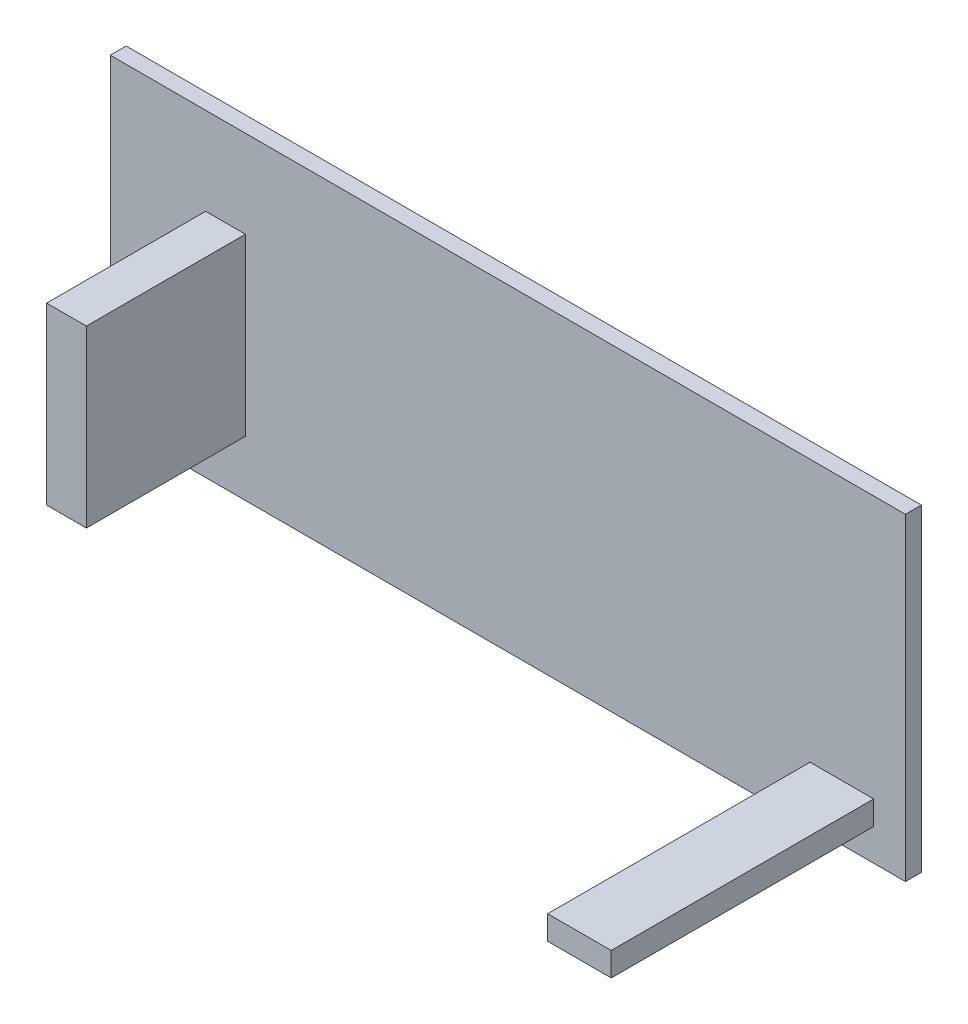
ISO-10303-21;
HEADER;
FILE_DESCRIPTION(('STEP AP214'),'2;1');
FILE_NAME('part.step','',(''),(''),'','','');
FILE_SCHEMA(('AUTOMOTIVE_DESIGN { 1 0 10303 214 1 1 1 1 }'));
ENDSEC;
DATA;
#1=APPLICATION_CONTEXT('core data for automotive mechanical design processes');
#2=APPLICATION_PROTOCOL_DEFINITION('international standard','automotive_design',2000,#1);
#3=PRODUCT_CONTEXT('',#1,'mechanical');
#4=PRODUCT('Part','Part','',(#3));
#5=PRODUCT_RELATED_PRODUCT_CATEGORY('part','',(#4));
#6=PRODUCT_DEFINITION_FORMATION('','',#4);
#7=PRODUCT_DEFINITION_CONTEXT('part definition',#1,'design');
#8=PRODUCT_DEFINITION('design','',#6,#7);
#9=PRODUCT_DEFINITION_SHAPE('','',#8);
#10=(LENGTH_UNIT() NAMED_UNIT(*) SI_UNIT(.MILLI.,.METRE.));
#11=(NAMED_UNIT(*) PLANE_ANGLE_UNIT() SI_UNIT($,.RADIAN.));
#12=(NAMED_UNIT(*) SI_UNIT($,.STERADIAN.) SOLID_ANGLE_UNIT());
#13=UNCERTAINTY_MEASURE_WITH_UNIT(LENGTH_MEASURE(1.E-05),#10,'distance_accuracy_value','');
#14=(GEOMETRIC_REPRESENTATION_CONTEXT(3) GLOBAL_UNCERTAINTY_ASSIGNED_CONTEXT((#13)) GLOBAL_UNIT_ASSIGNED_CONTEXT((#10,
#11,#12)) REPRESENTATION_CONTEXT('',''));
#15=CARTESIAN_POINT('',(0.,0.,0.));
#16=DIRECTION('',(0.,0.,1.));
#17=DIRECTION('',(1.,0.,0.));
#18=AXIS2_PLACEMENT_3D('',#15,#16,#17);
#19=CARTESIAN_POINT('',(0.,0.,2.));
#20=DIRECTION('',(0.,0.,1.));
#21=DIRECTION('',(1.,0.,0.));
#22=AXIS2_PLACEMENT_3D('',#19,#20,#21);
#23=PLANE('',#22);
#24=DIRECTION('',(0.,-1.,0.));
#25=VECTOR('',#24,1.);
#26=CARTESIAN_POINT('',(-50.,20.,2.));
#27=LINE('',#26,#25);
#28=CARTESIAN_POINT('',(-50.,20.,2.));
#29=VERTEX_POINT('',#28);
#30=CARTESIAN_POINT('',(-50.,-20.,2.));
#31=VERTEX_POINT('',#30);
#32=EDGE_CURVE('E188',#29,#31,#27,.T.);
#33=ORIENTED_EDGE('',*,*,#32,.T.);
#34=DIRECTION('',(1.,0.,0.));
#35=VECTOR('',#34,1.);
#36=CARTESIAN_POINT('',(-50.,-20.,2.));
#37=LINE('',#36,#35);
#38=CARTESIAN_POINT('',(50.,-20.,2.));
#39=VERTEX_POINT('',#38);
#40=EDGE_CURVE('E191',#31,#39,#37,.T.);
#41=ORIENTED_EDGE('',*,*,#40,.T.);
#42=DIRECTION('',(0.,1.,0.));
#43=VECTOR('',#42,1.);
#44=CARTESIAN_POINT('',(50.,20.,2.));
#45=LINE('',#44,#43);
#46=CARTESIAN_POINT('',(50.,20.,2.));
#47=VERTEX_POINT('',#46);
#48=EDGE_CURVE('E194',#39,#47,#45,.T.);
#49=ORIENTED_EDGE('',*,*,#48,.T.);
#50=DIRECTION('',(-1.,0.,0.));
#51=VECTOR('',#50,1.);
#52=CARTESIAN_POINT('',(-50.,20.,2.));
#53=LINE('',#52,#51);
#54=EDGE_CURVE('E196',#47,#29,#53,.T.);
#55=ORIENTED_EDGE('',*,*,#54,.T.);
#56=EDGE_LOOP('',(#33,#41,#49,#55));
#57=FACE_BOUND('',#56,.T.);
#58=DIRECTION('',(1.,0.,0.));
#59=VECTOR('',#58,1.);
#60=CARTESIAN_POINT('',(-38.,-13.,2.));
#61=LINE('',#60,#59);
#62=CARTESIAN_POINT('',(-38.,-13.,2.));
#63=VERTEX_POINT('',#62);
#64=CARTESIAN_POINT('',(-33.,-13.,2.));
#65=VERTEX_POINT('',#64);
#66=EDGE_CURVE('E174',#63,#65,#61,.T.);
#67=ORIENTED_EDGE('',*,*,#66,.F.);
#68=DIRECTION('',(0.,-1.,0.));
#69=VECTOR('',#68,1.);
#70=CARTESIAN_POINT('',(-38.,9.,2.));
#71=LINE('',#70,#69);
#72=CARTESIAN_POINT('',(-38.,9.,2.));
#73=VERTEX_POINT('',#72);
#74=EDGE_CURVE('E160',#73,#63,#71,.T.);
#75=ORIENTED_EDGE('',*,*,#74,.F.);
#76=DIRECTION('',(-1.,0.,0.));
#77=VECTOR('',#76,1.);
#78=CARTESIAN_POINT('',(-38.,9.,2.));
#79=LINE('',#78,#77);
#80=CARTESIAN_POINT('',(-33.,9.,2.));
#81=VERTEX_POINT('',#80);
#82=EDGE_CURVE('E165',#81,#73,#79,.T.);
#83=ORIENTED_EDGE('',*,*,#82,.F.);
#84=DIRECTION('',(0.,1.,0.));
#85=VECTOR('',#84,1.);
#86=CARTESIAN_POINT('',(-33.,9.,2.));
#87=LINE('',#86,#85);
#88=EDGE_CURVE('E176',#65,#81,#87,.T.);
#89=ORIENTED_EDGE('',*,*,#88,.F.);
#90=EDGE_LOOP('',(#67,#75,#83,#89));
#91=FACE_BOUND('',#90,.T.);
#92=DIRECTION('',(-1.,0.,0.));
#93=VECTOR('',#92,1.);
#94=CARTESIAN_POINT('',(0.,-16.,2.));
#95=LINE('',#94,#93);
#96=CARTESIAN_POINT('',(46.,-16.,2.));
#97=VERTEX_POINT('',#96);
#98=CARTESIAN_POINT('',(38.,-16.,2.));
#99=VERTEX_POINT('',#98);
#100=EDGE_CURVE('E157',#97,#99,#95,.T.);
#101=ORIENTED_EDGE('',*,*,#100,.T.);
#102=DIRECTION('',(0.,1.,0.));
#103=VECTOR('',#102,1.);
#104=CARTESIAN_POINT('',(38.,0.,2.));
#105=LINE('',#104,#103);
#106=CARTESIAN_POINT('',(38.,-13.,2.));
#107=VERTEX_POINT('',#106);
#108=EDGE_CURVE('E146',#99,#107,#105,.T.);
#109=ORIENTED_EDGE('',*,*,#108,.T.);
#110=DIRECTION('',(1.,0.,0.));
#111=VECTOR('',#110,1.);
#112=CARTESIAN_POINT('',(0.,-13.,2.));
#113=LINE('',#112,#111);
#114=CARTESIAN_POINT('',(46.,-13.,2.));
#115=VERTEX_POINT('',#114);
#116=EDGE_CURVE('E147',#107,#115,#113,.T.);
#117=ORIENTED_EDGE('',*,*,#116,.T.);
#118=DIRECTION('',(0.,-1.,0.));
#119=VECTOR('',#118,1.);
#120=CARTESIAN_POINT('',(46.,0.,2.));
#121=LINE('',#120,#119);
#122=EDGE_CURVE('E150',#115,#97,#121,.T.);
#123=ORIENTED_EDGE('',*,*,#122,.T.);
#124=EDGE_LOOP('',(#101,#109,#117,#123));
#125=FACE_BOUND('',#124,.T.);
#126=ADVANCED_FACE('F33',(#57,#91,#125),#23,.T.);
#127=CARTESIAN_POINT('',(-50.,20.,2.));
#128=DIRECTION('',(1.,0.,0.));
#129=DIRECTION('',(0.,0.,-1.));
#130=AXIS2_PLACEMENT_3D('',#127,#128,#129);
#131=PLANE('',#130);
#132=DIRECTION('',(0.,-1.,0.));
#133=VECTOR('',#132,1.);
#134=CARTESIAN_POINT('',(-50.,20.,0.));
#135=LINE('',#134,#133);
#136=CARTESIAN_POINT('',(-50.,20.,0.));
#137=VERTEX_POINT('',#136);
#138=CARTESIAN_POINT('',(-50.,-20.,0.));
#139=VERTEX_POINT('',#138);
#140=EDGE_CURVE('E187',#137,#139,#135,.T.);
#141=ORIENTED_EDGE('',*,*,#140,.T.);
#142=DIRECTION('',(0.,0.,-1.));
#143=VECTOR('',#142,1.);
#144=CARTESIAN_POINT('',(-50.,-20.,2.));
#145=LINE('',#144,#143);
#146=EDGE_CURVE('E11',#31,#139,#145,.T.);
#147=ORIENTED_EDGE('',*,*,#146,.F.);
#148=ORIENTED_EDGE('',*,*,#32,.F.);
#149=DIRECTION('',(0.,0.,-1.));
#150=VECTOR('',#149,1.);
#151=CARTESIAN_POINT('',(-50.,20.,2.));
#152=LINE('',#151,#150);
#153=EDGE_CURVE('E198',#29,#137,#152,.T.);
#154=ORIENTED_EDGE('',*,*,#153,.T.);
#155=EDGE_LOOP('',(#141,#147,#148,#154));
#156=FACE_BOUND('',#155,.T.);
#157=ADVANCED_FACE('F35',(#156),#131,.F.);
#158=CARTESIAN_POINT('',(-50.,-20.,2.));
#159=DIRECTION('',(0.,1.,0.));
#160=DIRECTION('',(0.,0.,1.));
#161=AXIS2_PLACEMENT_3D('',#158,#159,#160);
#162=PLANE('',#161);
#163=DIRECTION('',(1.,0.,0.));
#164=VECTOR('',#163,1.);
#165=CARTESIAN_POINT('',(-50.,-20.,0.));
#166=LINE('',#165,#164);
#167=CARTESIAN_POINT('',(50.,-20.,0.));
#168=VERTEX_POINT('',#167);
#169=EDGE_CURVE('E201',#139,#168,#166,.T.);
#170=ORIENTED_EDGE('',*,*,#169,.T.);
#171=DIRECTION('',(0.,0.,-1.));
#172=VECTOR('',#171,1.);
#173=CARTESIAN_POINT('',(50.,-20.,2.));
#174=LINE('',#173,#172);
#175=EDGE_CURVE('E41',#39,#168,#174,.T.);
#176=ORIENTED_EDGE('',*,*,#175,.F.);
#177=ORIENTED_EDGE('',*,*,#40,.F.);
#178=ORIENTED_EDGE('',*,*,#146,.T.);
#179=EDGE_LOOP('',(#170,#176,#177,#178));
#180=FACE_BOUND('',#179,.T.);
#181=ADVANCED_FACE('F231',(#180),#162,.F.);
#182=CARTESIAN_POINT('',(50.,20.,2.));
#183=DIRECTION('',(-1.,0.,0.));
#184=DIRECTION('',(0.,-1.,0.));
#185=AXIS2_PLACEMENT_3D('',#182,#183,#184);
#186=PLANE('',#185);
#187=DIRECTION('',(0.,1.,0.));
#188=VECTOR('',#187,1.);
#189=CARTESIAN_POINT('',(50.,20.,0.));
#190=LINE('',#189,#188);
#191=CARTESIAN_POINT('',(50.,20.,0.));
#192=VERTEX_POINT('',#191);
#193=EDGE_CURVE('E203',#168,#192,#190,.T.);
#194=ORIENTED_EDGE('',*,*,#193,.T.);
#195=DIRECTION('',(0.,0.,-1.));
#196=VECTOR('',#195,1.);
#197=CARTESIAN_POINT('',(50.,20.,2.));
#198=LINE('',#197,#196);
#199=EDGE_CURVE('E208',#47,#192,#198,.T.);
#200=ORIENTED_EDGE('',*,*,#199,.F.);
#201=ORIENTED_EDGE('',*,*,#48,.F.);
#202=ORIENTED_EDGE('',*,*,#175,.T.);
#203=EDGE_LOOP('',(#194,#200,#201,#202));
#204=FACE_BOUND('',#203,.T.);
#205=ADVANCED_FACE('F215',(#204),#186,.F.);
#206=CARTESIAN_POINT('',(-50.,20.,2.));
#207=DIRECTION('',(0.,-1.,0.));
#208=DIRECTION('',(0.,0.,-1.));
#209=AXIS2_PLACEMENT_3D('',#206,#207,#208);
#210=PLANE('',#209);
#211=DIRECTION('',(-1.,0.,0.));
#212=VECTOR('',#211,1.);
#213=CARTESIAN_POINT('',(-50.,20.,0.));
#214=LINE('',#213,#212);
#215=EDGE_CURVE('E192',#192,#137,#214,.T.);
#216=ORIENTED_EDGE('',*,*,#215,.T.);
#217=ORIENTED_EDGE('',*,*,#153,.F.);
#218=ORIENTED_EDGE('',*,*,#54,.F.);
#219=ORIENTED_EDGE('',*,*,#199,.T.);
#220=EDGE_LOOP('',(#216,#217,#218,#219));
#221=FACE_BOUND('',#220,.T.);
#222=ADVANCED_FACE('F224',(#221),#210,.F.);
#223=CARTESIAN_POINT('',(0.,0.,0.));
#224=DIRECTION('',(0.,0.,1.));
#225=DIRECTION('',(1.,0.,0.));
#226=AXIS2_PLACEMENT_3D('',#223,#224,#225);
#227=PLANE('',#226);
#228=ORIENTED_EDGE('',*,*,#140,.F.);
#229=ORIENTED_EDGE('',*,*,#215,.F.);
#230=ORIENTED_EDGE('',*,*,#193,.F.);
#231=ORIENTED_EDGE('',*,*,#169,.F.);
#232=EDGE_LOOP('',(#228,#229,#230,#231));
#233=FACE_BOUND('',#232,.T.);
#234=ADVANCED_FACE('F221',(#233),#227,.F.);
#235=CARTESIAN_POINT('',(-38.,9.,22.));
#236=DIRECTION('',(1.,0.,0.));
#237=DIRECTION('',(0.,0.,-1.));
#238=AXIS2_PLACEMENT_3D('',#235,#236,#237);
#239=PLANE('',#238);
#240=ORIENTED_EDGE('',*,*,#74,.T.);
#241=DIRECTION('',(0.,0.,-1.));
#242=VECTOR('',#241,1.);
#243=CARTESIAN_POINT('',(-38.,-13.,22.));
#244=LINE('',#243,#242);
#245=CARTESIAN_POINT('',(-38.,-13.,22.));
#246=VERTEX_POINT('',#245);
#247=EDGE_CURVE('E185',#246,#63,#244,.T.);
#248=ORIENTED_EDGE('',*,*,#247,.F.);
#249=DIRECTION('',(0.,-1.,0.));
#250=VECTOR('',#249,1.);
#251=CARTESIAN_POINT('',(-38.,9.,22.));
#252=LINE('',#251,#250);
#253=CARTESIAN_POINT('',(-38.,9.,22.));
#254=VERTEX_POINT('',#253);
#255=EDGE_CURVE('E161',#254,#246,#252,.T.);
#256=ORIENTED_EDGE('',*,*,#255,.F.);
#257=DIRECTION('',(0.,0.,-1.));
#258=VECTOR('',#257,1.);
#259=CARTESIAN_POINT('',(-38.,9.,22.));
#260=LINE('',#259,#258);
#261=EDGE_CURVE('E171',#254,#73,#260,.T.);
#262=ORIENTED_EDGE('',*,*,#261,.T.);
#263=EDGE_LOOP('',(#240,#248,#256,#262));
#264=FACE_BOUND('',#263,.T.);
#265=ADVANCED_FACE('F244',(#264),#239,.F.);
#266=CARTESIAN_POINT('',(-38.,-13.,22.));
#267=DIRECTION('',(0.,1.,0.));
#268=DIRECTION('',(0.,0.,1.));
#269=AXIS2_PLACEMENT_3D('',#266,#267,#268);
#270=PLANE('',#269);
#271=ORIENTED_EDGE('',*,*,#66,.T.);
#272=DIRECTION('',(0.,0.,-1.));
#273=VECTOR('',#272,1.);
#274=CARTESIAN_POINT('',(-33.,-13.,22.));
#275=LINE('',#274,#273);
#276=CARTESIAN_POINT('',(-33.,-13.,22.));
#277=VERTEX_POINT('',#276);
#278=EDGE_CURVE('E182',#277,#65,#275,.T.);
#279=ORIENTED_EDGE('',*,*,#278,.F.);
#280=DIRECTION('',(1.,0.,0.));
#281=VECTOR('',#280,1.);
#282=CARTESIAN_POINT('',(-38.,-13.,22.));
#283=LINE('',#282,#281);
#284=EDGE_CURVE('E164',#246,#277,#283,.T.);
#285=ORIENTED_EDGE('',*,*,#284,.F.);
#286=ORIENTED_EDGE('',*,*,#247,.T.);
#287=EDGE_LOOP('',(#271,#279,#285,#286));
#288=FACE_BOUND('',#287,.T.);
#289=ADVANCED_FACE('F264',(#288),#270,.F.);
#290=CARTESIAN_POINT('',(-33.,9.,22.));
#291=DIRECTION('',(-1.,0.,0.));
#292=DIRECTION('',(0.,0.,1.));
#293=AXIS2_PLACEMENT_3D('',#290,#291,#292);
#294=PLANE('',#293);
#295=ORIENTED_EDGE('',*,*,#88,.T.);
#296=DIRECTION('',(0.,0.,-1.));
#297=VECTOR('',#296,1.);
#298=CARTESIAN_POINT('',(-33.,9.,22.));
#299=LINE('',#298,#297);
#300=CARTESIAN_POINT('',(-33.,9.,22.));
#301=VERTEX_POINT('',#300);
#302=EDGE_CURVE('E56',#301,#81,#299,.T.);
#303=ORIENTED_EDGE('',*,*,#302,.F.);
#304=DIRECTION('',(0.,1.,0.));
#305=VECTOR('',#304,1.);
#306=CARTESIAN_POINT('',(-33.,9.,22.));
#307=LINE('',#306,#305);
#308=EDGE_CURVE('E167',#277,#301,#307,.T.);
#309=ORIENTED_EDGE('',*,*,#308,.F.);
#310=ORIENTED_EDGE('',*,*,#278,.T.);
#311=EDGE_LOOP('',(#295,#303,#309,#310));
#312=FACE_BOUND('',#311,.T.);
#313=ADVANCED_FACE('F271',(#312),#294,.F.);
#314=CARTESIAN_POINT('',(-38.,9.,22.));
#315=DIRECTION('',(0.,-1.,0.));
#316=DIRECTION('',(0.,0.,-1.));
#317=AXIS2_PLACEMENT_3D('',#314,#315,#316);
#318=PLANE('',#317);
#319=ORIENTED_EDGE('',*,*,#82,.T.);
#320=ORIENTED_EDGE('',*,*,#261,.F.);
#321=DIRECTION('',(-1.,0.,0.));
#322=VECTOR('',#321,1.);
#323=CARTESIAN_POINT('',(-38.,9.,22.));
#324=LINE('',#323,#322);
#325=EDGE_CURVE('E169',#301,#254,#324,.T.);
#326=ORIENTED_EDGE('',*,*,#325,.F.);
#327=ORIENTED_EDGE('',*,*,#302,.T.);
#328=EDGE_LOOP('',(#319,#320,#326,#327));
#329=FACE_BOUND('',#328,.T.);
#330=ADVANCED_FACE('F278',(#329),#318,.F.);
#331=CARTESIAN_POINT('',(0.,0.,22.));
#332=DIRECTION('',(0.,0.,1.));
#333=DIRECTION('',(1.,0.,0.));
#334=AXIS2_PLACEMENT_3D('',#331,#332,#333);
#335=PLANE('',#334);
#336=ORIENTED_EDGE('',*,*,#255,.T.);
#337=ORIENTED_EDGE('',*,*,#284,.T.);
#338=ORIENTED_EDGE('',*,*,#308,.T.);
#339=ORIENTED_EDGE('',*,*,#325,.T.);
#340=EDGE_LOOP('',(#336,#337,#338,#339));
#341=FACE_BOUND('',#340,.T.);
#342=ADVANCED_FACE('F286',(#341),#335,.T.);
#343=CARTESIAN_POINT('',(38.,-13.,35.));
#344=DIRECTION('',(1.,0.,0.));
#345=DIRECTION('',(0.,0.,-1.));
#346=AXIS2_PLACEMENT_3D('',#343,#344,#345);
#347=PLANE('',#346);
#348=ORIENTED_EDGE('',*,*,#108,.F.);
#349=DIRECTION('',(0.,0.,-1.));
#350=VECTOR('',#349,1.);
#351=CARTESIAN_POINT('',(38.,-16.,35.));
#352=LINE('',#351,#350);
#353=CARTESIAN_POINT('',(38.,-16.,35.));
#354=VERTEX_POINT('',#353);
#355=EDGE_CURVE('E128',#354,#99,#352,.T.);
#356=ORIENTED_EDGE('',*,*,#355,.F.);
#357=DIRECTION('',(0.,-1.,0.));
#358=VECTOR('',#357,1.);
#359=CARTESIAN_POINT('',(38.,-13.,35.));
#360=LINE('',#359,#358);
#361=CARTESIAN_POINT('',(38.,-13.,35.));
#362=VERTEX_POINT('',#361);
#363=EDGE_CURVE('E135',#362,#354,#360,.T.);
#364=ORIENTED_EDGE('',*,*,#363,.F.);
#365=DIRECTION('',(0.,0.,-1.));
#366=VECTOR('',#365,1.);
#367=CARTESIAN_POINT('',(38.,-13.,35.));
#368=LINE('',#367,#366);
#369=EDGE_CURVE('E370',#362,#107,#368,.T.);
#370=ORIENTED_EDGE('',*,*,#369,.T.);
#371=EDGE_LOOP('',(#348,#356,#364,#370));
#372=FACE_BOUND('',#371,.T.);
#373=ADVANCED_FACE('F144',(#372),#347,.F.);
#374=CARTESIAN_POINT('',(38.,-16.,35.));
#375=DIRECTION('',(0.,1.,0.));
#376=DIRECTION('',(0.,0.,1.));
#377=AXIS2_PLACEMENT_3D('',#374,#375,#376);
#378=PLANE('',#377);
#379=ORIENTED_EDGE('',*,*,#100,.F.);
#380=DIRECTION('',(0.,0.,-1.));
#381=VECTOR('',#380,1.);
#382=CARTESIAN_POINT('',(46.,-16.,35.));
#383=LINE('',#382,#381);
#384=CARTESIAN_POINT('',(46.,-16.,35.));
#385=VERTEX_POINT('',#384);
#386=EDGE_CURVE('E131',#385,#97,#383,.T.);
#387=ORIENTED_EDGE('',*,*,#386,.F.);
#388=DIRECTION('',(1.,0.,0.));
#389=VECTOR('',#388,1.);
#390=CARTESIAN_POINT('',(38.,-16.,35.));
#391=LINE('',#390,#389);
#392=EDGE_CURVE('E124',#354,#385,#391,.T.);
#393=ORIENTED_EDGE('',*,*,#392,.F.);
#394=ORIENTED_EDGE('',*,*,#355,.T.);
#395=EDGE_LOOP('',(#379,#387,#393,#394));
#396=FACE_BOUND('',#395,.T.);
#397=ADVANCED_FACE('F126',(#396),#378,.F.);
#398=CARTESIAN_POINT('',(46.,-13.,35.));
#399=DIRECTION('',(-1.,0.,0.));
#400=DIRECTION('',(0.,0.,1.));
#401=AXIS2_PLACEMENT_3D('',#398,#399,#400);
#402=PLANE('',#401);
#403=ORIENTED_EDGE('',*,*,#122,.F.);
#404=DIRECTION('',(0.,0.,-1.));
#405=VECTOR('',#404,1.);
#406=CARTESIAN_POINT('',(46.,-13.,35.));
#407=LINE('',#406,#405);
#408=CARTESIAN_POINT('',(46.,-13.,35.));
#409=VERTEX_POINT('',#408);
#410=EDGE_CURVE('E48',#409,#115,#407,.T.);
#411=ORIENTED_EDGE('',*,*,#410,.F.);
#412=DIRECTION('',(0.,1.,0.));
#413=VECTOR('',#412,1.);
#414=CARTESIAN_POINT('',(46.,-13.,35.));
#415=LINE('',#414,#413);
#416=EDGE_CURVE('E134',#385,#409,#415,.T.);
#417=ORIENTED_EDGE('',*,*,#416,.F.);
#418=ORIENTED_EDGE('',*,*,#386,.T.);
#419=EDGE_LOOP('',(#403,#411,#417,#418));
#420=FACE_BOUND('',#419,.T.);
#421=ADVANCED_FACE('F305',(#420),#402,.F.);
#422=CARTESIAN_POINT('',(38.,-13.,35.));
#423=DIRECTION('',(0.,-1.,0.));
#424=DIRECTION('',(0.,0.,-1.));
#425=AXIS2_PLACEMENT_3D('',#422,#423,#424);
#426=PLANE('',#425);
#427=ORIENTED_EDGE('',*,*,#116,.F.);
#428=ORIENTED_EDGE('',*,*,#369,.F.);
#429=DIRECTION('',(-1.,0.,0.));
#430=VECTOR('',#429,1.);
#431=CARTESIAN_POINT('',(38.,-13.,35.));
#432=LINE('',#431,#430);
#433=EDGE_CURVE('E139',#409,#362,#432,.T.);
#434=ORIENTED_EDGE('',*,*,#433,.F.);
#435=ORIENTED_EDGE('',*,*,#410,.T.);
#436=EDGE_LOOP('',(#427,#428,#434,#435));
#437=FACE_BOUND('',#436,.T.);
#438=ADVANCED_FACE('F312',(#437),#426,.F.);
#439=CARTESIAN_POINT('',(0.,0.,35.));
#440=DIRECTION('',(0.,0.,1.));
#441=DIRECTION('',(1.,0.,0.));
#442=AXIS2_PLACEMENT_3D('',#439,#440,#441);
#443=PLANE('',#442);
#444=ORIENTED_EDGE('',*,*,#363,.T.);
#445=ORIENTED_EDGE('',*,*,#392,.T.);
#446=ORIENTED_EDGE('',*,*,#416,.T.);
#447=ORIENTED_EDGE('',*,*,#433,.T.);
#448=EDGE_LOOP('',(#444,#445,#446,#447));
#449=FACE_BOUND('',#448,.T.);
#450=ADVANCED_FACE('F138',(#449),#443,.T.);
#451=CLOSED_SHELL('',(#126,#157,#181,#205,#222,#234,#265,#289,#313,#330,#342,#373,#397,#421,
#438,#450));
#452=MANIFOLD_SOLID_BREP('B2',#451);
#453=ADVANCED_BREP_SHAPE_REPRESENTATION('',(#18,#452),#14);
#454=SHAPE_DEFINITION_REPRESENTATION(#9,#453);
ENDSEC;
END-ISO-10303-21;
